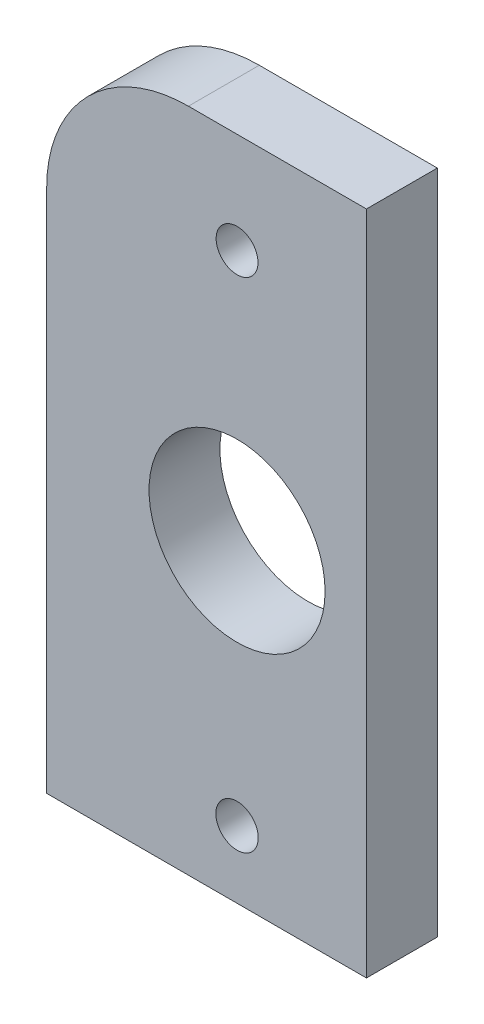
ISO-10303-21;
HEADER;
FILE_DESCRIPTION(('STEP AP214'),'2;1');
FILE_NAME('part.step','',(''),(''),'','','');
FILE_SCHEMA(('AUTOMOTIVE_DESIGN { 1 0 10303 214 1 1 1 1 }'));
ENDSEC;
DATA;
#1=APPLICATION_CONTEXT('core data for automotive mechanical design processes');
#2=APPLICATION_PROTOCOL_DEFINITION('international standard','automotive_design',2000,#1);
#3=PRODUCT_CONTEXT('',#1,'mechanical');
#4=PRODUCT('Part','Part','',(#3));
#5=PRODUCT_RELATED_PRODUCT_CATEGORY('part','',(#4));
#6=PRODUCT_DEFINITION_FORMATION('','',#4);
#7=PRODUCT_DEFINITION_CONTEXT('part definition',#1,'design');
#8=PRODUCT_DEFINITION('design','',#6,#7);
#9=PRODUCT_DEFINITION_SHAPE('','',#8);
#10=(LENGTH_UNIT() NAMED_UNIT(*) SI_UNIT(.MILLI.,.METRE.));
#11=(NAMED_UNIT(*) PLANE_ANGLE_UNIT() SI_UNIT($,.RADIAN.));
#12=(NAMED_UNIT(*) SI_UNIT($,.STERADIAN.) SOLID_ANGLE_UNIT());
#13=UNCERTAINTY_MEASURE_WITH_UNIT(LENGTH_MEASURE(1.E-05),#10,'distance_accuracy_value','');
#14=(GEOMETRIC_REPRESENTATION_CONTEXT(3) GLOBAL_UNCERTAINTY_ASSIGNED_CONTEXT((#13)) GLOBAL_UNIT_ASSIGNED_CONTEXT((#10,
#11,#12)) REPRESENTATION_CONTEXT('',''));
#15=CARTESIAN_POINT('',(0.,0.,0.));
#16=DIRECTION('',(0.,0.,1.));
#17=DIRECTION('',(1.,0.,0.));
#18=AXIS2_PLACEMENT_3D('',#15,#16,#17);
#19=CARTESIAN_POINT('',(-107.121412130557,101.902374012965,5.08));
#20=DIRECTION('',(0.,0.,-1.));
#21=DIRECTION('',(-1.,0.,0.));
#22=AXIS2_PLACEMENT_3D('',#19,#20,#21);
#23=CYLINDRICAL_SURFACE('',#22,10.16);
#24=CARTESIAN_POINT('',(-107.121412130557,101.902374012965,0.));
#25=DIRECTION('',(0.,0.,1.));
#26=DIRECTION('',(1.,0.,0.));
#27=AXIS2_PLACEMENT_3D('',#24,#25,#26);
#28=CIRCLE('',#27,10.16);
#29=CARTESIAN_POINT('',(-117.281412130557,101.902374012965,0.));
#30=VERTEX_POINT('',#29);
#31=CARTESIAN_POINT('',(-107.121412130558,112.062374012965,0.));
#32=VERTEX_POINT('',#31);
#33=EDGE_CURVE('E116',#30,#32,#28,.F.);
#34=ORIENTED_EDGE('',*,*,#33,.F.);
#35=DIRECTION('',(0.,0.,-1.));
#36=VECTOR('',#35,1.);
#37=CARTESIAN_POINT('',(-117.281412130557,101.902374012965,5.08));
#38=LINE('',#37,#36);
#39=CARTESIAN_POINT('',(-117.281412130557,101.902374012965,5.08));
#40=VERTEX_POINT('',#39);
#41=EDGE_CURVE('E11',#40,#30,#38,.T.);
#42=ORIENTED_EDGE('',*,*,#41,.F.);
#43=CARTESIAN_POINT('',(-107.121412130557,101.902374012965,5.08));
#44=DIRECTION('',(0.,0.,1.));
#45=DIRECTION('',(1.,0.,0.));
#46=AXIS2_PLACEMENT_3D('',#43,#44,#45);
#47=CIRCLE('',#46,10.16);
#48=CARTESIAN_POINT('',(-107.121412130558,112.062374012965,5.08));
#49=VERTEX_POINT('',#48);
#50=EDGE_CURVE('E241',#40,#49,#47,.F.);
#51=ORIENTED_EDGE('',*,*,#50,.T.);
#52=DIRECTION('',(0.,0.,-1.));
#53=VECTOR('',#52,1.);
#54=CARTESIAN_POINT('',(-107.121412130558,112.062374012965,5.08));
#55=LINE('',#54,#53);
#56=EDGE_CURVE('E50',#49,#32,#55,.T.);
#57=ORIENTED_EDGE('',*,*,#56,.T.);
#58=EDGE_LOOP('',(#34,#42,#51,#57));
#59=FACE_BOUND('',#58,.T.);
#60=ADVANCED_FACE('F33',(#59),#23,.T.);
#61=CARTESIAN_POINT('',(-117.281412130556,-9.09669877109464E-13,5.08));
#62=DIRECTION('',(-1.,0.,0.));
#63=DIRECTION('',(0.,-1.,0.));
#64=AXIS2_PLACEMENT_3D('',#61,#62,#63);
#65=PLANE('',#64);
#66=DIRECTION('',(0.,1.,0.));
#67=VECTOR('',#66,1.);
#68=CARTESIAN_POINT('',(-117.281412130556,-9.09669877109464E-13,0.));
#69=LINE('',#68,#67);
#70=CARTESIAN_POINT('',(-117.281412130556,64.3285920966825,0.));
#71=VERTEX_POINT('',#70);
#72=EDGE_CURVE('E118',#71,#30,#69,.T.);
#73=ORIENTED_EDGE('',*,*,#72,.F.);
#74=DIRECTION('',(0.,0.,-1.));
#75=VECTOR('',#74,1.);
#76=CARTESIAN_POINT('',(-117.281412130556,64.3285920966825,5.08));
#77=LINE('',#76,#75);
#78=CARTESIAN_POINT('',(-117.281412130556,64.3285920966825,5.08));
#79=VERTEX_POINT('',#78);
#80=EDGE_CURVE('E42',#79,#71,#77,.T.);
#81=ORIENTED_EDGE('',*,*,#80,.F.);
#82=DIRECTION('',(0.,1.,0.));
#83=VECTOR('',#82,1.);
#84=CARTESIAN_POINT('',(-117.281412130556,-9.09669877109464E-13,5.08));
#85=LINE('',#84,#83);
#86=EDGE_CURVE('E99',#79,#40,#85,.T.);
#87=ORIENTED_EDGE('',*,*,#86,.T.);
#88=ORIENTED_EDGE('',*,*,#41,.T.);
#89=EDGE_LOOP('',(#73,#81,#87,#88));
#90=FACE_BOUND('',#89,.T.);
#91=ADVANCED_FACE('F131',(#90),#65,.T.);
#92=CARTESIAN_POINT('',(0.,64.3285920966825,5.08));
#93=DIRECTION('',(0.,-1.,0.));
#94=DIRECTION('',(0.,0.,-1.));
#95=AXIS2_PLACEMENT_3D('',#92,#93,#94);
#96=PLANE('',#95);
#97=DIRECTION('',(-1.,0.,0.));
#98=VECTOR('',#97,1.);
#99=CARTESIAN_POINT('',(0.,64.3285920966825,0.));
#100=LINE('',#99,#98);
#101=CARTESIAN_POINT('',(-94.3616745850101,64.3285920966825,0.));
#102=VERTEX_POINT('',#101);
#103=EDGE_CURVE('E87',#102,#71,#100,.T.);
#104=ORIENTED_EDGE('',*,*,#103,.F.);
#105=DIRECTION('',(0.,0.,-1.));
#106=VECTOR('',#105,1.);
#107=CARTESIAN_POINT('',(-94.3616745850101,64.3285920966825,5.08));
#108=LINE('',#107,#106);
#109=CARTESIAN_POINT('',(-94.3616745850101,64.3285920966825,5.08));
#110=VERTEX_POINT('',#109);
#111=EDGE_CURVE('E82',#110,#102,#108,.T.);
#112=ORIENTED_EDGE('',*,*,#111,.F.);
#113=DIRECTION('',(-1.,0.,0.));
#114=VECTOR('',#113,1.);
#115=CARTESIAN_POINT('',(0.,64.3285920966825,5.08));
#116=LINE('',#115,#114);
#117=EDGE_CURVE('E85',#110,#79,#116,.T.);
#118=ORIENTED_EDGE('',*,*,#117,.T.);
#119=ORIENTED_EDGE('',*,*,#80,.T.);
#120=EDGE_LOOP('',(#104,#112,#118,#119));
#121=FACE_BOUND('',#120,.T.);
#122=ADVANCED_FACE('F84',(#121),#96,.T.);
#123=CARTESIAN_POINT('',(-94.3616745850101,0.,5.08));
#124=DIRECTION('',(1.,0.,0.));
#125=DIRECTION('',(0.,0.,-1.));
#126=AXIS2_PLACEMENT_3D('',#123,#124,#125);
#127=PLANE('',#126);
#128=DIRECTION('',(0.,-1.,0.));
#129=VECTOR('',#128,1.);
#130=CARTESIAN_POINT('',(-94.3616745850101,0.,0.));
#131=LINE('',#130,#129);
#132=CARTESIAN_POINT('',(-94.3616745850101,112.062374012965,0.));
#133=VERTEX_POINT('',#132);
#134=EDGE_CURVE('E122',#133,#102,#131,.T.);
#135=ORIENTED_EDGE('',*,*,#134,.F.);
#136=DIRECTION('',(0.,0.,-1.));
#137=VECTOR('',#136,1.);
#138=CARTESIAN_POINT('',(-94.3616745850101,112.062374012965,5.08));
#139=LINE('',#138,#137);
#140=CARTESIAN_POINT('',(-94.3616745850101,112.062374012965,5.08));
#141=VERTEX_POINT('',#140);
#142=EDGE_CURVE('E66',#141,#133,#139,.T.);
#143=ORIENTED_EDGE('',*,*,#142,.F.);
#144=DIRECTION('',(0.,-1.,0.));
#145=VECTOR('',#144,1.);
#146=CARTESIAN_POINT('',(-94.3616745850101,0.,5.08));
#147=LINE('',#146,#145);
#148=EDGE_CURVE('E97',#141,#110,#147,.T.);
#149=ORIENTED_EDGE('',*,*,#148,.T.);
#150=ORIENTED_EDGE('',*,*,#111,.T.);
#151=EDGE_LOOP('',(#135,#143,#149,#150));
#152=FACE_BOUND('',#151,.T.);
#153=ADVANCED_FACE('F101',(#152),#127,.T.);
#154=CARTESIAN_POINT('',(-103.635582515292,104.844491411556,5.08));
#155=DIRECTION('',(0.,0.,-1.));
#156=DIRECTION('',(-1.,0.,0.));
#157=AXIS2_PLACEMENT_3D('',#154,#155,#156);
#158=CYLINDRICAL_SURFACE('',#157,1.5);
#159=CARTESIAN_POINT('',(-103.635582515292,104.844491411556,5.08));
#160=DIRECTION('',(0.,0.,1.));
#161=DIRECTION('',(1.,0.,0.));
#162=AXIS2_PLACEMENT_3D('',#159,#160,#161);
#163=CIRCLE('',#162,1.5);
#164=CARTESIAN_POINT('',(-102.135582515292,104.844491411556,5.08));
#165=VERTEX_POINT('',#164);
#166=EDGE_CURVE('E238',#165,#165,#163,.T.);
#167=ORIENTED_EDGE('',*,*,#166,.T.);
#168=EDGE_LOOP('',(#167));
#169=FACE_BOUND('',#168,.T.);
#170=CARTESIAN_POINT('',(-103.635582515292,104.844491411556,0.));
#171=DIRECTION('',(0.,0.,1.));
#172=DIRECTION('',(1.,0.,0.));
#173=AXIS2_PLACEMENT_3D('',#170,#171,#172);
#174=CIRCLE('',#173,1.5);
#175=CARTESIAN_POINT('',(-102.135582515292,104.844491411556,0.));
#176=VERTEX_POINT('',#175);
#177=EDGE_CURVE('E113',#176,#176,#174,.T.);
#178=ORIENTED_EDGE('',*,*,#177,.F.);
#179=EDGE_LOOP('',(#178));
#180=FACE_BOUND('',#179,.T.);
#181=ADVANCED_FACE('F155',(#169,#180),#158,.F.);
#182=CARTESIAN_POINT('',(-103.635582515292,69.1404876925652,5.08));
#183=DIRECTION('',(0.,0.,-1.));
#184=DIRECTION('',(-1.,0.,0.));
#185=AXIS2_PLACEMENT_3D('',#182,#183,#184);
#186=CYLINDRICAL_SURFACE('',#185,1.51791338852264);
#187=CARTESIAN_POINT('',(-103.635582515292,69.1404876925652,5.08));
#188=DIRECTION('',(0.,0.,1.));
#189=DIRECTION('',(1.,0.,0.));
#190=AXIS2_PLACEMENT_3D('',#187,#188,#189);
#191=CIRCLE('',#190,1.51791338852264);
#192=CARTESIAN_POINT('',(-102.11766912677,69.1404876925652,5.08));
#193=VERTEX_POINT('',#192);
#194=EDGE_CURVE('E165',#193,#193,#191,.T.);
#195=ORIENTED_EDGE('',*,*,#194,.T.);
#196=EDGE_LOOP('',(#195));
#197=FACE_BOUND('',#196,.T.);
#198=CARTESIAN_POINT('',(-103.635582515292,69.1404876925652,0.));
#199=DIRECTION('',(0.,0.,1.));
#200=DIRECTION('',(1.,0.,0.));
#201=AXIS2_PLACEMENT_3D('',#198,#199,#200);
#202=CIRCLE('',#201,1.51791338852264);
#203=CARTESIAN_POINT('',(-102.11766912677,69.1404876925652,0.));
#204=VERTEX_POINT('',#203);
#205=EDGE_CURVE('E110',#204,#204,#202,.T.);
#206=ORIENTED_EDGE('',*,*,#205,.F.);
#207=EDGE_LOOP('',(#206));
#208=FACE_BOUND('',#207,.T.);
#209=ADVANCED_FACE('F143',(#197,#208),#186,.F.);
#210=CARTESIAN_POINT('',(-103.635582515292,86.8287381906903,5.08));
#211=DIRECTION('',(0.,0.,-1.));
#212=DIRECTION('',(-1.,0.,0.));
#213=AXIS2_PLACEMENT_3D('',#210,#211,#212);
#214=CYLINDRICAL_SURFACE('',#213,6.30892038834635);
#215=CARTESIAN_POINT('',(-103.635582515292,86.8287381906903,5.08));
#216=DIRECTION('',(0.,0.,1.));
#217=DIRECTION('',(1.,0.,0.));
#218=AXIS2_PLACEMENT_3D('',#215,#216,#217);
#219=CIRCLE('',#218,6.30892038834635);
#220=CARTESIAN_POINT('',(-97.326662126946,86.8287381906903,5.08));
#221=VERTEX_POINT('',#220);
#222=EDGE_CURVE('E127',#221,#221,#219,.T.);
#223=ORIENTED_EDGE('',*,*,#222,.T.);
#224=EDGE_LOOP('',(#223));
#225=FACE_BOUND('',#224,.T.);
#226=CARTESIAN_POINT('',(-103.635582515292,86.8287381906903,0.));
#227=DIRECTION('',(0.,0.,1.));
#228=DIRECTION('',(1.,0.,0.));
#229=AXIS2_PLACEMENT_3D('',#226,#227,#228);
#230=CIRCLE('',#229,6.30892038834635);
#231=CARTESIAN_POINT('',(-97.326662126946,86.8287381906903,0.));
#232=VERTEX_POINT('',#231);
#233=EDGE_CURVE('E107',#232,#232,#230,.T.);
#234=ORIENTED_EDGE('',*,*,#233,.F.);
#235=EDGE_LOOP('',(#234));
#236=FACE_BOUND('',#235,.T.);
#237=ADVANCED_FACE('F35',(#225,#236),#214,.F.);
#238=CARTESIAN_POINT('',(2.43763297205831E-13,112.062374012965,5.08));
#239=DIRECTION('',(0.,1.,0.));
#240=DIRECTION('',(-1.,0.,0.));
#241=AXIS2_PLACEMENT_3D('',#238,#239,#240);
#242=PLANE('',#241);
#243=DIRECTION('',(1.,0.,0.));
#244=VECTOR('',#243,1.);
#245=CARTESIAN_POINT('',(2.43763297205831E-13,112.062374012965,0.));
#246=LINE('',#245,#244);
#247=EDGE_CURVE('E124',#32,#133,#246,.T.);
#248=ORIENTED_EDGE('',*,*,#247,.F.);
#249=ORIENTED_EDGE('',*,*,#56,.F.);
#250=DIRECTION('',(1.,0.,0.));
#251=VECTOR('',#250,1.);
#252=CARTESIAN_POINT('',(2.43763297205831E-13,112.062374012965,5.08));
#253=LINE('',#252,#251);
#254=EDGE_CURVE('E102',#49,#141,#253,.T.);
#255=ORIENTED_EDGE('',*,*,#254,.T.);
#256=ORIENTED_EDGE('',*,*,#142,.T.);
#257=EDGE_LOOP('',(#248,#249,#255,#256));
#258=FACE_BOUND('',#257,.T.);
#259=ADVANCED_FACE('F134',(#258),#242,.T.);
#260=CARTESIAN_POINT('',(0.,0.,5.08));
#261=DIRECTION('',(0.,0.,1.));
#262=DIRECTION('',(1.,0.,0.));
#263=AXIS2_PLACEMENT_3D('',#260,#261,#262);
#264=PLANE('',#263);
#265=ORIENTED_EDGE('',*,*,#222,.F.);
#266=EDGE_LOOP('',(#265));
#267=FACE_BOUND('',#266,.T.);
#268=ORIENTED_EDGE('',*,*,#194,.F.);
#269=EDGE_LOOP('',(#268));
#270=FACE_BOUND('',#269,.T.);
#271=ORIENTED_EDGE('',*,*,#166,.F.);
#272=EDGE_LOOP('',(#271));
#273=FACE_BOUND('',#272,.T.);
#274=ORIENTED_EDGE('',*,*,#50,.F.);
#275=ORIENTED_EDGE('',*,*,#86,.F.);
#276=ORIENTED_EDGE('',*,*,#117,.F.);
#277=ORIENTED_EDGE('',*,*,#148,.F.);
#278=ORIENTED_EDGE('',*,*,#254,.F.);
#279=EDGE_LOOP('',(#274,#275,#276,#277,#278));
#280=FACE_BOUND('',#279,.T.);
#281=ADVANCED_FACE('F95',(#267,#270,#273,#280),#264,.T.);
#282=CARTESIAN_POINT('',(0.,0.,0.));
#283=DIRECTION('',(0.,0.,1.));
#284=DIRECTION('',(1.,0.,0.));
#285=AXIS2_PLACEMENT_3D('',#282,#283,#284);
#286=PLANE('',#285);
#287=ORIENTED_EDGE('',*,*,#233,.T.);
#288=EDGE_LOOP('',(#287));
#289=FACE_BOUND('',#288,.T.);
#290=ORIENTED_EDGE('',*,*,#205,.T.);
#291=EDGE_LOOP('',(#290));
#292=FACE_BOUND('',#291,.T.);
#293=ORIENTED_EDGE('',*,*,#177,.T.);
#294=EDGE_LOOP('',(#293));
#295=FACE_BOUND('',#294,.T.);
#296=ORIENTED_EDGE('',*,*,#33,.T.);
#297=ORIENTED_EDGE('',*,*,#247,.T.);
#298=ORIENTED_EDGE('',*,*,#134,.T.);
#299=ORIENTED_EDGE('',*,*,#103,.T.);
#300=ORIENTED_EDGE('',*,*,#72,.T.);
#301=EDGE_LOOP('',(#296,#297,#298,#299,#300));
#302=FACE_BOUND('',#301,.T.);
#303=ADVANCED_FACE('F133',(#289,#292,#295,#302),#286,.F.);
#304=CLOSED_SHELL('',(#60,#91,#122,#153,#181,#209,#237,#259,#281,#303));
#305=MANIFOLD_SOLID_BREP('B2',#304);
#306=ADVANCED_BREP_SHAPE_REPRESENTATION('',(#18,#305),#14);
#307=SHAPE_DEFINITION_REPRESENTATION(#9,#306);
ENDSEC;
END-ISO-10303-21;
